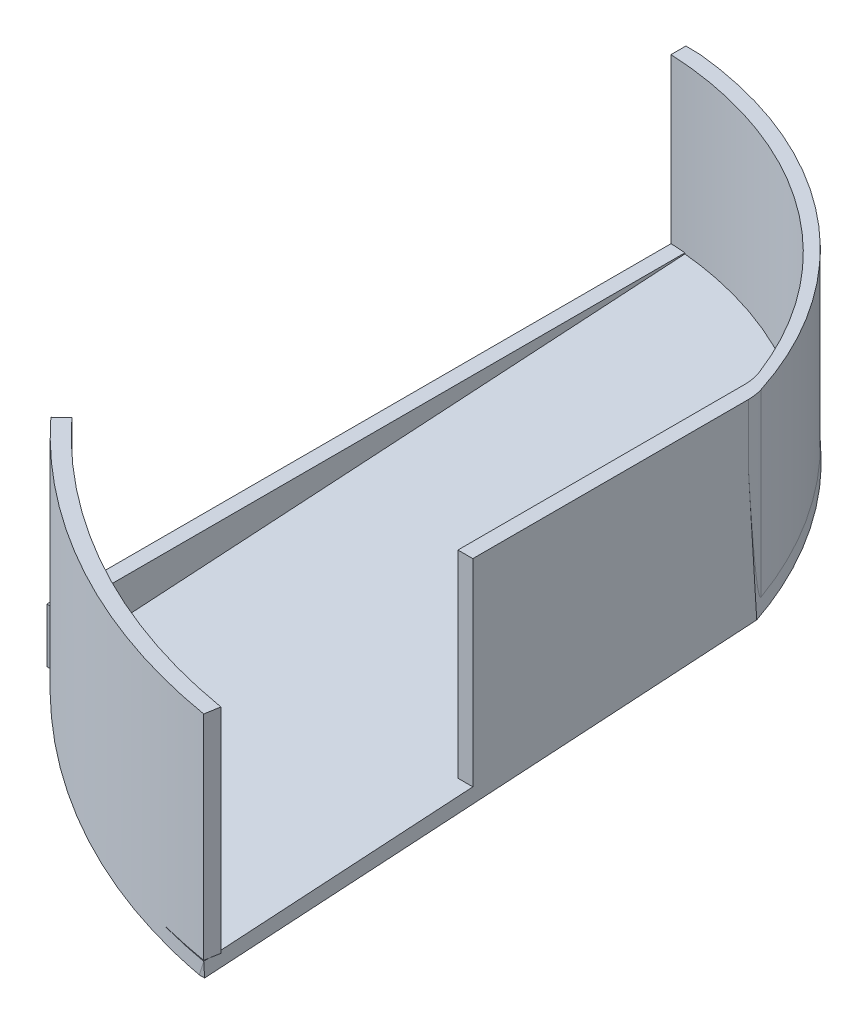
ISO-10303-21;
HEADER;
FILE_DESCRIPTION(('STEP AP214'),'2;1');
FILE_NAME('part.step','',(''),(''),'','','');
FILE_SCHEMA(('AUTOMOTIVE_DESIGN { 1 0 10303 214 1 1 1 1 }'));
ENDSEC;
DATA;
#1=APPLICATION_CONTEXT('core data for automotive mechanical design processes');
#2=APPLICATION_PROTOCOL_DEFINITION('international standard','automotive_design',2000,#1);
#3=PRODUCT_CONTEXT('',#1,'mechanical');
#4=PRODUCT('Part','Part','',(#3));
#5=PRODUCT_RELATED_PRODUCT_CATEGORY('part','',(#4));
#6=PRODUCT_DEFINITION_FORMATION('','',#4);
#7=PRODUCT_DEFINITION_CONTEXT('part definition',#1,'design');
#8=PRODUCT_DEFINITION('design','',#6,#7);
#9=PRODUCT_DEFINITION_SHAPE('','',#8);
#10=(LENGTH_UNIT() NAMED_UNIT(*) SI_UNIT(.MILLI.,.METRE.));
#11=(NAMED_UNIT(*) PLANE_ANGLE_UNIT() SI_UNIT($,.RADIAN.));
#12=(NAMED_UNIT(*) SI_UNIT($,.STERADIAN.) SOLID_ANGLE_UNIT());
#13=UNCERTAINTY_MEASURE_WITH_UNIT(LENGTH_MEASURE(1.E-05),#10,'distance_accuracy_value','');
#14=(GEOMETRIC_REPRESENTATION_CONTEXT(3) GLOBAL_UNCERTAINTY_ASSIGNED_CONTEXT((#13)) GLOBAL_UNIT_ASSIGNED_CONTEXT((#10,
#11,#12)) REPRESENTATION_CONTEXT('',''));
#15=CARTESIAN_POINT('',(0.,0.,0.));
#16=DIRECTION('',(0.,0.,1.));
#17=DIRECTION('',(1.,0.,0.));
#18=AXIS2_PLACEMENT_3D('',#15,#16,#17);
#19=CARTESIAN_POINT('',(3.,0.,0.));
#20=DIRECTION('',(0.,0.998103426506934,0.0615593209442483));
#21=DIRECTION('',(0.,-0.0615593209442483,0.998103426506934));
#22=AXIS2_PLACEMENT_3D('',#19,#20,#21);
#23=PLANE('',#22);
#24=DIRECTION('',(1.,0.,0.));
#25=VECTOR('',#24,1.);
#26=CARTESIAN_POINT('',(3.,0.,0.));
#27=LINE('',#26,#25);
#28=CARTESIAN_POINT('',(3.,0.,0.));
#29=VERTEX_POINT('',#28);
#30=CARTESIAN_POINT('',(4.15307025275991,0.,0.));
#31=VERTEX_POINT('',#30);
#32=EDGE_CURVE('E257',#29,#31,#27,.T.);
#33=ORIENTED_EDGE('',*,*,#32,.T.);
#34=CARTESIAN_POINT('',(-4.59620733064153,-4.63796637234277,75.198524890352));
#35=DIRECTION('',(0.,-0.998103426506934,-0.0615593209442483));
#36=DIRECTION('',(0.,0.0615593209442483,-0.998103426506934));
#37=AXIS2_PLACEMENT_3D('',#34,#35,#36);
#38=ELLIPSE('',#37,75.8496534533457,75.7057990111478);
#39=CARTESIAN_POINT('',(68.,-3.31349227238321,53.7239193032215));
#40=VERTEX_POINT('',#39);
#41=EDGE_CURVE('E230',#31,#40,#38,.T.);
#42=ORIENTED_EDGE('',*,*,#41,.T.);
#43=DIRECTION('',(0.,-0.0615593209442483,0.998103426506934));
#44=VECTOR('',#43,1.);
#45=CARTESIAN_POINT('',(68.,0.,0.));
#46=LINE('',#45,#44);
#47=CARTESIAN_POINT('',(68.,-10.1765886039971,165.));
#48=VERTEX_POINT('',#47);
#49=EDGE_CURVE('E445',#40,#48,#46,.T.);
#50=ORIENTED_EDGE('',*,*,#49,.T.);
#51=DIRECTION('',(-1.,0.,0.));
#52=VECTOR('',#51,1.);
#53=CARTESIAN_POINT('',(3.,-10.1765886039971,165.));
#54=LINE('',#53,#52);
#55=CARTESIAN_POINT('',(66.9381779480019,-10.1765886039971,165.));
#56=VERTEX_POINT('',#55);
#57=EDGE_CURVE('E440',#48,#56,#54,.T.);
#58=ORIENTED_EDGE('',*,*,#57,.T.);
#59=CARTESIAN_POINT('',(87.7574845787787,-2.98775015092859,48.4424392187365));
#60=DIRECTION('',(0.,0.998103426506934,0.0615593209442483));
#61=DIRECTION('',(0.,0.0615593209442483,-0.998103426506934));
#62=AXIS2_PLACEMENT_3D('',#59,#60,#61);
#63=ELLIPSE('',#62,118.627301690277,118.402316294337);
#64=CARTESIAN_POINT('',(0.796643413223996,-7.943746722035,128.797405509834));
#65=VERTEX_POINT('',#64);
#66=EDGE_CURVE('E341',#56,#65,#63,.F.);
#67=ORIENTED_EDGE('',*,*,#66,.T.);
#68=DIRECTION('',(-1.,0.,0.));
#69=VECTOR('',#68,1.);
#70=CARTESIAN_POINT('',(3.,-7.943746722035,128.797405509834));
#71=LINE('',#70,#69);
#72=CARTESIAN_POINT('',(0.,-7.943746722035,128.797405509834));
#73=VERTEX_POINT('',#72);
#74=EDGE_CURVE('E339',#65,#73,#71,.T.);
#75=ORIENTED_EDGE('',*,*,#74,.T.);
#76=DIRECTION('',(0.,0.0615593209442483,-0.998103426506934));
#77=VECTOR('',#76,1.);
#78=CARTESIAN_POINT('',(0.,0.,0.));
#79=LINE('',#78,#77);
#80=CARTESIAN_POINT('',(0.,-0.185028883709039,3.));
#81=VERTEX_POINT('',#80);
#82=EDGE_CURVE('E296',#73,#81,#79,.T.);
#83=ORIENTED_EDGE('',*,*,#82,.T.);
#84=DIRECTION('',(-1.,0.,0.));
#85=VECTOR('',#84,1.);
#86=CARTESIAN_POINT('',(115.,-0.185028883709039,3.));
#87=LINE('',#86,#85);
#88=CARTESIAN_POINT('',(17.5857661755868,-0.185028883709039,3.));
#89=VERTEX_POINT('',#88);
#90=EDGE_CURVE('E552',#89,#81,#87,.T.);
#91=ORIENTED_EDGE('',*,*,#90,.F.);
#92=CARTESIAN_POINT('',(-4.59620733064153,-4.64935662477894,75.3832028531848));
#93=DIRECTION('',(0.,0.998103426506934,0.0615593209442483));
#94=DIRECTION('',(0.,0.0615593209442483,-0.998103426506934));
#95=AXIS2_PLACEMENT_3D('',#92,#93,#94);
#96=ELLIPSE('',#95,75.8496534533457,75.7057990111478);
#97=CARTESIAN_POINT('',(3.,-0.00366751783602553,0.0594639782044853));
#98=VERTEX_POINT('',#97);
#99=EDGE_CURVE('E238',#89,#98,#96,.T.);
#100=ORIENTED_EDGE('',*,*,#99,.T.);
#101=DIRECTION('',(-0.999802868562587,0.00122226495098737,-0.0198174186616625));
#102=VECTOR('',#101,1.);
#103=CARTESIAN_POINT('',(2.99881732795793,-0.00366607201242203,0.0594405360763079));
#104=LINE('',#103,#102);
#105=CARTESIAN_POINT('',(0.,0.,0.));
#106=VERTEX_POINT('',#105);
#107=EDGE_CURVE('E253',#98,#106,#104,.T.);
#108=ORIENTED_EDGE('',*,*,#107,.T.);
#109=DIRECTION('',(-1.,0.,0.));
#110=VECTOR('',#109,1.);
#111=CARTESIAN_POINT('',(3.,0.,0.));
#112=LINE('',#111,#110);
#113=EDGE_CURVE('E309',#29,#106,#112,.T.);
#114=ORIENTED_EDGE('',*,*,#113,.F.);
#115=EDGE_LOOP('',(#33,#42,#50,#58,#67,#75,#83,#91,#100,#108,#114));
#116=FACE_BOUND('',#115,.T.);
#117=ADVANCED_FACE('F41',(#116),#23,.F.);
#118=CARTESIAN_POINT('',(0.,0.,0.));
#119=DIRECTION('',(1.,0.,0.));
#120=DIRECTION('',(0.,0.,-1.));
#121=AXIS2_PLACEMENT_3D('',#118,#119,#120);
#122=PLANE('',#121);
#123=DIRECTION('',(0.,0.0298112208071704,-0.999555546787664));
#124=VECTOR('',#123,1.);
#125=CARTESIAN_POINT('',(0.,0.,-3.20392731393326));
#126=LINE('',#125,#124);
#127=CARTESIAN_POINT('',(0.,-0.095555454534513,0.));
#128=VERTEX_POINT('',#127);
#129=EDGE_CURVE('E548',#81,#128,#126,.T.);
#130=ORIENTED_EDGE('',*,*,#129,.F.);
#131=ORIENTED_EDGE('',*,*,#82,.F.);
#132=DIRECTION('',(0.,1.,0.));
#133=VECTOR('',#132,1.);
#134=CARTESIAN_POINT('',(0.,-30.,128.797405509834));
#135=LINE('',#134,#133);
#136=CARTESIAN_POINT('',(0.,2.99999999999998,128.797405509834));
#137=VERTEX_POINT('',#136);
#138=EDGE_CURVE('E498',#73,#137,#135,.T.);
#139=ORIENTED_EDGE('',*,*,#138,.T.);
#140=DIRECTION('',(0.,0.,1.));
#141=VECTOR('',#140,1.);
#142=CARTESIAN_POINT('',(0.,3.,0.));
#143=LINE('',#142,#141);
#144=CARTESIAN_POINT('',(0.,3.,3.));
#145=VERTEX_POINT('',#144);
#146=EDGE_CURVE('E304',#145,#137,#143,.T.);
#147=ORIENTED_EDGE('',*,*,#146,.F.);
#148=DIRECTION('',(0.,1.,0.));
#149=VECTOR('',#148,1.);
#150=CARTESIAN_POINT('',(0.,-7.,3.));
#151=LINE('',#150,#149);
#152=CARTESIAN_POINT('',(0.,36.,3.00000000000001));
#153=VERTEX_POINT('',#152);
#154=EDGE_CURVE('E352',#145,#153,#151,.T.);
#155=ORIENTED_EDGE('',*,*,#154,.T.);
#156=DIRECTION('',(0.,0.,1.));
#157=VECTOR('',#156,1.);
#158=CARTESIAN_POINT('',(0.,36.,0.));
#159=LINE('',#158,#157);
#160=CARTESIAN_POINT('',(0.,36.,0.));
#161=VERTEX_POINT('',#160);
#162=EDGE_CURVE('E340',#161,#153,#159,.T.);
#163=ORIENTED_EDGE('',*,*,#162,.F.);
#164=DIRECTION('',(0.,1.,0.));
#165=VECTOR('',#164,1.);
#166=CARTESIAN_POINT('',(0.,-7.,0.));
#167=LINE('',#166,#165);
#168=CARTESIAN_POINT('',(0.,3.,0.));
#169=VERTEX_POINT('',#168);
#170=EDGE_CURVE('E328',#169,#161,#167,.T.);
#171=ORIENTED_EDGE('',*,*,#170,.F.);
#172=DIRECTION('',(0.,1.,0.));
#173=VECTOR('',#172,1.);
#174=CARTESIAN_POINT('',(0.,0.,0.));
#175=LINE('',#174,#173);
#176=EDGE_CURVE('E301',#106,#169,#175,.T.);
#177=ORIENTED_EDGE('',*,*,#176,.F.);
#178=EDGE_CURVE('E336',#128,#106,#167,.T.);
#179=ORIENTED_EDGE('',*,*,#178,.F.);
#180=EDGE_LOOP('',(#130,#131,#139,#147,#155,#163,#171,#177,#179));
#181=FACE_BOUND('',#180,.T.);
#182=ADVANCED_FACE('F333',(#181),#122,.F.);
#183=CARTESIAN_POINT('',(3.,-7.18227832447634,165.184677962833));
#184=DIRECTION('',(0.,-0.0615593209442483,0.998103426506934));
#185=DIRECTION('',(0.,-0.998103426506934,-0.0615593209442483));
#186=AXIS2_PLACEMENT_3D('',#183,#184,#185);
#187=PLANE('',#186);
#188=CARTESIAN_POINT('',(87.7574845787787,-1900.00414057506,48.4424392187362));
#189=DIRECTION('',(0.,-0.0615593209442483,0.998103426506934));
#190=DIRECTION('',(0.,0.998103426506934,0.0615593209442483));
#191=AXIS2_PLACEMENT_3D('',#188,#189,#190);
#192=ELLIPSE('',#191,1923.38567869469,118.402316294337);
#193=CARTESIAN_POINT('',(68.0000000000001,-7.18227832447634,165.184677962833));
#194=VERTEX_POINT('',#193);
#195=EDGE_CURVE('E500',#56,#194,#192,.F.);
#196=ORIENTED_EDGE('',*,*,#195,.F.);
#197=ORIENTED_EDGE('',*,*,#57,.F.);
#198=DIRECTION('',(0.,-0.998103426506934,-0.0615593209442483));
#199=VECTOR('',#198,1.);
#200=CARTESIAN_POINT('',(68.,-7.18227832447634,165.184677962833));
#201=LINE('',#200,#199);
#202=EDGE_CURVE('E290',#194,#48,#201,.T.);
#203=ORIENTED_EDGE('',*,*,#202,.F.);
#204=EDGE_LOOP('',(#196,#197,#203));
#205=FACE_BOUND('',#204,.T.);
#206=ADVANCED_FACE('F510',(#205),#187,.T.);
#207=CARTESIAN_POINT('',(3.,3.,0.));
#208=DIRECTION('',(0.,-1.,0.));
#209=DIRECTION('',(0.,0.,-1.));
#210=AXIS2_PLACEMENT_3D('',#207,#208,#209);
#211=PLANE('',#210);
#212=DIRECTION('',(-1.,0.,0.));
#213=VECTOR('',#212,1.);
#214=CARTESIAN_POINT('',(0.796643413223996,2.99999999999998,128.797405509834));
#215=LINE('',#214,#213);
#216=CARTESIAN_POINT('',(0.796643413223996,2.99999999999998,128.797405509834));
#217=VERTEX_POINT('',#216);
#218=EDGE_CURVE('E458',#217,#137,#215,.T.);
#219=ORIENTED_EDGE('',*,*,#218,.F.);
#220=DIRECTION('',(0.734452195591999,0.,-0.678660424947626));
#221=VECTOR('',#220,1.);
#222=CARTESIAN_POINT('',(66.1834256013238,2.99999999999999,68.3776509607101));
#223=LINE('',#222,#221);
#224=CARTESIAN_POINT('',(2.99999999999998,3.00000000000001,126.761424234991));
#225=VERTEX_POINT('',#224);
#226=EDGE_CURVE('E255',#217,#225,#223,.T.);
#227=ORIENTED_EDGE('',*,*,#226,.T.);
#228=DIRECTION('',(0.,0.,1.));
#229=VECTOR('',#228,1.);
#230=CARTESIAN_POINT('',(3.,3.,0.));
#231=LINE('',#230,#229);
#232=CARTESIAN_POINT('',(3.,3.,3.20852248665127));
#233=VERTEX_POINT('',#232);
#234=EDGE_CURVE('E288',#233,#225,#231,.T.);
#235=ORIENTED_EDGE('',*,*,#234,.F.);
#236=CARTESIAN_POINT('',(-3.54035613265457,2.99999999999999,75.6195503174139));
#237=DIRECTION('',(0.,-1.,0.));
#238=DIRECTION('',(0.,0.,-1.));
#239=AXIS2_PLACEMENT_3D('',#236,#237,#238);
#240=CIRCLE('',#239,72.7057990111478);
#241=EDGE_CURVE('E237',#233,#145,#240,.F.);
#242=ORIENTED_EDGE('',*,*,#241,.T.);
#243=ORIENTED_EDGE('',*,*,#146,.T.);
#244=EDGE_LOOP('',(#219,#227,#235,#242,#243));
#245=FACE_BOUND('',#244,.T.);
#246=ADVANCED_FACE('F456',(#245),#211,.F.);
#247=DIRECTION('',(-1.,0.,0.));
#248=VECTOR('',#247,1.);
#249=CARTESIAN_POINT('',(3.,3.,0.));
#250=LINE('',#249,#248);
#251=CARTESIAN_POINT('',(3.,3.,0.));
#252=VERTEX_POINT('',#251);
#253=EDGE_CURVE('E272',#252,#169,#250,.T.);
#254=ORIENTED_EDGE('',*,*,#253,.T.);
#255=DIRECTION('',(0.999803615381979,0.,0.0198174334646132));
#256=VECTOR('',#255,1.);
#257=CARTESIAN_POINT('',(2.99882180799263,3.,0.0594406248765367));
#258=LINE('',#257,#256);
#259=CARTESIAN_POINT('',(3.,3.,0.0594639782044853));
#260=VERTEX_POINT('',#259);
#261=EDGE_CURVE('E260',#169,#260,#258,.T.);
#262=ORIENTED_EDGE('',*,*,#261,.T.);
#263=EDGE_CURVE('E275',#252,#260,#231,.T.);
#264=ORIENTED_EDGE('',*,*,#263,.F.);
#265=EDGE_LOOP('',(#254,#262,#264));
#266=FACE_BOUND('',#265,.T.);
#267=ADVANCED_FACE('F313',(#266),#211,.F.);
#268=CARTESIAN_POINT('',(0.,2.9943102795208,0.184677962832745));
#269=DIRECTION('',(0.,0.998103426506934,0.0615593209442483));
#270=DIRECTION('',(0.,-0.0615593209442483,0.998103426506934));
#271=AXIS2_PLACEMENT_3D('',#268,#269,#270);
#272=PLANE('',#271);
#273=DIRECTION('',(0.,-0.0615593209442483,0.998103426506934));
#274=VECTOR('',#273,1.);
#275=CARTESIAN_POINT('',(65.,2.9943102795208,0.184677962832745));
#276=LINE('',#275,#274);
#277=CARTESIAN_POINT('',(65.,-0.27217050237445,53.1463677771406));
#278=VERTEX_POINT('',#277);
#279=CARTESIAN_POINT('',(65.,-3.83707161600224,110.946550789113));
#280=VERTEX_POINT('',#279);
#281=EDGE_CURVE('E276',#278,#280,#276,.T.);
#282=ORIENTED_EDGE('',*,*,#281,.F.);
#283=CARTESIAN_POINT('',(55.,-0.27217050237445,53.1463677771406));
#284=DIRECTION('',(0.,0.998103426506934,0.0615593209442483));
#285=DIRECTION('',(0.,0.0615593209442483,-0.998103426506934));
#286=AXIS2_PLACEMENT_3D('',#283,#284,#285);
#287=ELLIPSE('',#286,10.01900177319,10.);
#288=CARTESIAN_POINT('',(64.3357164817001,-0.0511283263508837,49.5624596068169));
#289=VERTEX_POINT('',#288);
#290=EDGE_CURVE('E408',#278,#289,#287,.T.);
#291=ORIENTED_EDGE('',*,*,#290,.T.);
#292=CARTESIAN_POINT('',(-3.54035613265457,-1.65823312864653,75.6195503174139));
#293=DIRECTION('',(0.,0.998103426506934,0.0615593209442483));
#294=DIRECTION('',(0.,0.0615593209442483,-0.998103426506934));
#295=AXIS2_PLACEMENT_3D('',#292,#293,#294);
#296=ELLIPSE('',#295,72.8439529213887,72.7057990111478);
#297=CARTESIAN_POINT('',(3.,2.80781075393686,3.20852248665119));
#298=VERTEX_POINT('',#297);
#299=EDGE_CURVE('E268',#298,#289,#296,.F.);
#300=ORIENTED_EDGE('',*,*,#299,.F.);
#301=DIRECTION('',(0.,0.0615593209442483,-0.998103426506934));
#302=VECTOR('',#301,1.);
#303=CARTESIAN_POINT('',(3.,2.9943102795208,0.184677962832745));
#304=LINE('',#303,#302);
#305=CARTESIAN_POINT('',(2.99999999999998,-4.81247440923244,126.761424234991));
#306=VERTEX_POINT('',#305);
#307=EDGE_CURVE('E267',#306,#298,#304,.T.);
#308=ORIENTED_EDGE('',*,*,#307,.F.);
#309=CARTESIAN_POINT('',(87.7574845787787,0.0179503810284094,48.4424392187365));
#310=DIRECTION('',(0.,0.998103426506934,0.0615593209442483));
#311=DIRECTION('',(0.,0.0615593209442483,-0.998103426506934));
#312=AXIS2_PLACEMENT_3D('',#309,#310,#311);
#313=ELLIPSE('',#312,115.62160115832,115.402316294337);
#314=CARTESIAN_POINT('',(68.,-6.99454840864892,162.140884279421));
#315=VERTEX_POINT('',#314);
#316=EDGE_CURVE('E285',#315,#306,#313,.F.);
#317=ORIENTED_EDGE('',*,*,#316,.F.);
#318=DIRECTION('',(0.,-0.0615593209442483,0.998103426506934));
#319=VECTOR('',#318,1.);
#320=CARTESIAN_POINT('',(68.,2.9943102795208,0.184677962832745));
#321=LINE('',#320,#319);
#322=CARTESIAN_POINT('',(68.,-3.83707161600224,110.946550789113));
#323=VERTEX_POINT('',#322);
#324=EDGE_CURVE('E286',#323,#315,#321,.T.);
#325=ORIENTED_EDGE('',*,*,#324,.F.);
#326=DIRECTION('',(1.,0.,0.));
#327=VECTOR('',#326,1.);
#328=CARTESIAN_POINT('',(0.,-3.83707161600224,110.946550789113));
#329=LINE('',#328,#327);
#330=EDGE_CURVE('E225',#280,#323,#329,.T.);
#331=ORIENTED_EDGE('',*,*,#330,.F.);
#332=EDGE_LOOP('',(#282,#291,#300,#308,#317,#325,#331));
#333=FACE_BOUND('',#332,.T.);
#334=ADVANCED_FACE('F431',(#333),#272,.T.);
#335=CARTESIAN_POINT('',(87.7574845787787,0.0179503810284094,48.4424392187365));
#336=DIRECTION('',(0.,0.998103426506934,0.0615593209442483));
#337=DIRECTION('',(0.,0.0615593209442483,-0.998103426506934));
#338=AXIS2_PLACEMENT_3D('',#335,#336,#337);
#339=ELLIPSE('',#338,118.627301690277,118.402316294337);
#340=CARTESIAN_POINT('',(55.0211960997228,-7.00000000000002,162.229274663265));
#341=VERTEX_POINT('',#340);
#342=EDGE_CURVE('E492',#194,#341,#339,.F.);
#343=ORIENTED_EDGE('',*,*,#342,.F.);
#344=CARTESIAN_POINT('',(68.,-7.00000000000002,162.229274663265));
#345=VERTEX_POINT('',#344);
#346=EDGE_CURVE('E265',#345,#194,#321,.T.);
#347=ORIENTED_EDGE('',*,*,#346,.F.);
#348=DIRECTION('',(-1.,0.,0.));
#349=VECTOR('',#348,1.);
#350=CARTESIAN_POINT('',(0.,-7.00000000000002,162.229274663265));
#351=LINE('',#350,#349);
#352=EDGE_CURVE('E224',#345,#341,#351,.T.);
#353=ORIENTED_EDGE('',*,*,#352,.T.);
#354=EDGE_LOOP('',(#343,#347,#353));
#355=FACE_BOUND('',#354,.T.);
#356=ADVANCED_FACE('F494',(#355),#272,.T.);
#357=CARTESIAN_POINT('',(3.,0.,0.));
#358=DIRECTION('',(1.,0.,0.));
#359=DIRECTION('',(0.,0.,-1.));
#360=AXIS2_PLACEMENT_3D('',#357,#358,#359);
#361=PLANE('',#360);
#362=DIRECTION('',(0.,1.,0.));
#363=VECTOR('',#362,1.);
#364=CARTESIAN_POINT('',(2.99999999999998,-7.00000000000001,126.761424234991));
#365=LINE('',#364,#363);
#366=EDGE_CURVE('E368',#306,#225,#365,.T.);
#367=ORIENTED_EDGE('',*,*,#366,.F.);
#368=ORIENTED_EDGE('',*,*,#307,.T.);
#369=DIRECTION('',(0.,1.,0.));
#370=VECTOR('',#369,1.);
#371=CARTESIAN_POINT('',(3.,-7.,3.20852248665127));
#372=LINE('',#371,#370);
#373=EDGE_CURVE('E242',#233,#298,#372,.F.);
#374=ORIENTED_EDGE('',*,*,#373,.F.);
#375=ORIENTED_EDGE('',*,*,#234,.T.);
#376=EDGE_LOOP('',(#367,#368,#374,#375));
#377=FACE_BOUND('',#376,.T.);
#378=ADVANCED_FACE('F453',(#377),#361,.T.);
#379=DIRECTION('',(0.,1.,0.));
#380=VECTOR('',#379,1.);
#381=CARTESIAN_POINT('',(3.,-7.,0.0594639782044845));
#382=LINE('',#381,#380);
#383=CARTESIAN_POINT('',(3.,0.964130199768576,0.0594639782044508));
#384=VERTEX_POINT('',#383);
#385=EDGE_CURVE('E395',#384,#260,#382,.T.);
#386=ORIENTED_EDGE('',*,*,#385,.F.);
#387=DIRECTION('',(0.,-0.998103426506934,-0.0615593209442483));
#388=VECTOR('',#387,1.);
#389=CARTESIAN_POINT('',(3.,2.9943102795208,0.184677962832745));
#390=LINE('',#389,#388);
#391=EDGE_CURVE('E240',#384,#29,#390,.T.);
#392=ORIENTED_EDGE('',*,*,#391,.T.);
#393=DIRECTION('',(0.,1.,0.));
#394=VECTOR('',#393,1.);
#395=CARTESIAN_POINT('',(3.,0.,0.));
#396=LINE('',#395,#394);
#397=EDGE_CURVE('E298',#29,#252,#396,.T.);
#398=ORIENTED_EDGE('',*,*,#397,.T.);
#399=ORIENTED_EDGE('',*,*,#263,.T.);
#400=EDGE_LOOP('',(#386,#392,#398,#399));
#401=FACE_BOUND('',#400,.T.);
#402=ADVANCED_FACE('F446',(#401),#361,.T.);
#403=CARTESIAN_POINT('',(3.,0.,0.));
#404=DIRECTION('',(0.,0.,1.));
#405=DIRECTION('',(1.,0.,0.));
#406=AXIS2_PLACEMENT_3D('',#403,#404,#405);
#407=PLANE('',#406);
#408=ORIENTED_EDGE('',*,*,#176,.T.);
#409=ORIENTED_EDGE('',*,*,#253,.F.);
#410=ORIENTED_EDGE('',*,*,#397,.F.);
#411=ORIENTED_EDGE('',*,*,#113,.T.);
#412=EDGE_LOOP('',(#408,#409,#410,#411));
#413=FACE_BOUND('',#412,.T.);
#414=ADVANCED_FACE('F318',(#413),#407,.F.);
#415=CARTESIAN_POINT('',(68.,2.9943102795208,0.184677962832745));
#416=DIRECTION('',(1.,0.,0.));
#417=DIRECTION('',(0.,0.,-1.));
#418=AXIS2_PLACEMENT_3D('',#415,#416,#417);
#419=PLANE('',#418);
#420=DIRECTION('',(0.,0.998103426506934,0.0615593209442483));
#421=VECTOR('',#420,1.);
#422=CARTESIAN_POINT('',(68.,-115.10107604116,46.8292753574657));
#423=LINE('',#422,#421);
#424=CARTESIAN_POINT('',(68.,24.0086575671295,55.4090482650002));
#425=VERTEX_POINT('',#424);
#426=EDGE_CURVE('E231',#40,#425,#423,.T.);
#427=ORIENTED_EDGE('',*,*,#426,.T.);
#428=DIRECTION('',(0.,1.,0.));
#429=VECTOR('',#428,1.);
#430=CARTESIAN_POINT('',(68.,2.9943102795208,55.4090482650002));
#431=LINE('',#430,#429);
#432=CARTESIAN_POINT('',(68.,36.,55.4090482650002));
#433=VERTEX_POINT('',#432);
#434=EDGE_CURVE('E413',#425,#433,#431,.T.);
#435=ORIENTED_EDGE('',*,*,#434,.T.);
#436=DIRECTION('',(0.,0.,-1.));
#437=VECTOR('',#436,1.);
#438=CARTESIAN_POINT('',(68.,36.,53.9085972660542));
#439=LINE('',#438,#437);
#440=CARTESIAN_POINT('',(68.,36.,110.946550789113));
#441=VERTEX_POINT('',#440);
#442=EDGE_CURVE('E355',#441,#433,#439,.T.);
#443=ORIENTED_EDGE('',*,*,#442,.F.);
#444=DIRECTION('',(0.,1.,0.));
#445=VECTOR('',#444,1.);
#446=CARTESIAN_POINT('',(68.,-7.00000000000001,110.946550789113));
#447=LINE('',#446,#445);
#448=EDGE_CURVE('E388',#323,#441,#447,.T.);
#449=ORIENTED_EDGE('',*,*,#448,.F.);
#450=ORIENTED_EDGE('',*,*,#324,.T.);
#451=DIRECTION('',(0.,1.,0.));
#452=VECTOR('',#451,1.);
#453=CARTESIAN_POINT('',(68.,-7.00000000000002,162.140884279421));
#454=LINE('',#453,#452);
#455=CARTESIAN_POINT('',(68.,-7.00000000000002,162.140884279421));
#456=VERTEX_POINT('',#455);
#457=EDGE_CURVE('E249',#456,#315,#454,.T.);
#458=ORIENTED_EDGE('',*,*,#457,.F.);
#459=DIRECTION('',(0.,0.,1.));
#460=VECTOR('',#459,1.);
#461=CARTESIAN_POINT('',(68.,-7.,0.184677962832744));
#462=LINE('',#461,#460);
#463=EDGE_CURVE('E245',#456,#345,#462,.T.);
#464=ORIENTED_EDGE('',*,*,#463,.T.);
#465=ORIENTED_EDGE('',*,*,#346,.T.);
#466=ORIENTED_EDGE('',*,*,#202,.T.);
#467=ORIENTED_EDGE('',*,*,#49,.F.);
#468=EDGE_LOOP('',(#427,#435,#443,#449,#450,#458,#464,#465,#466,#467));
#469=FACE_BOUND('',#468,.T.);
#470=ADVANCED_FACE('F418',(#469),#419,.T.);
#471=CARTESIAN_POINT('',(3.,2.9943102795208,0.184677962832745));
#472=DIRECTION('',(0.,0.0615593209442483,-0.998103426506934));
#473=DIRECTION('',(0.,0.998103426506934,0.0615593209442483));
#474=AXIS2_PLACEMENT_3D('',#471,#472,#473);
#475=PLANE('',#474);
#476=DIRECTION('',(0.,0.998103426506934,0.0615593209442483));
#477=VECTOR('',#476,1.);
#478=CARTESIAN_POINT('',(4.15307025275991,-111.787583768777,-6.89464394575581));
#479=LINE('',#478,#477);
#480=CARTESIAN_POINT('',(4.15307025275991,2.9943102795208,0.184677962832745));
#481=VERTEX_POINT('',#480);
#482=EDGE_CURVE('E228',#31,#481,#479,.T.);
#483=ORIENTED_EDGE('',*,*,#482,.F.);
#484=ORIENTED_EDGE('',*,*,#32,.F.);
#485=ORIENTED_EDGE('',*,*,#391,.F.);
#486=CARTESIAN_POINT('',(-4.59620733064153,1222.2394905391,75.383202853185));
#487=DIRECTION('',(0.,0.0615593209442483,-0.998103426506934));
#488=DIRECTION('',(0.,0.998103426506934,0.0615593209442483));
#489=AXIS2_PLACEMENT_3D('',#486,#487,#488);
#490=ELLIPSE('',#489,1229.80237354651,75.7057990111478);
#491=EDGE_CURVE('E218',#481,#384,#490,.T.);
#492=ORIENTED_EDGE('',*,*,#491,.F.);
#493=EDGE_LOOP('',(#483,#484,#485,#492));
#494=FACE_BOUND('',#493,.T.);
#495=ADVANCED_FACE('F236',(#494),#475,.T.);
#496=CARTESIAN_POINT('',(-3.54035613265457,36.,75.6195503174139));
#497=DIRECTION('',(0.,-1.,0.));
#498=DIRECTION('',(0.,0.,-1.));
#499=AXIS2_PLACEMENT_3D('',#496,#497,#498);
#500=PLANE('',#499);
#501=ORIENTED_EDGE('',*,*,#442,.T.);
#502=CARTESIAN_POINT('',(58.,36.,55.4090482650002));
#503=DIRECTION('',(0.,-1.,0.));
#504=DIRECTION('',(0.,0.,-1.));
#505=AXIS2_PLACEMENT_3D('',#502,#503,#504);
#506=CIRCLE('',#505,10.);
#507=CARTESIAN_POINT('',(67.5267401466378,36.,52.3691104073393));
#508=VERTEX_POINT('',#507);
#509=EDGE_CURVE('E68',#433,#508,#506,.F.);
#510=ORIENTED_EDGE('',*,*,#509,.T.);
#511=CARTESIAN_POINT('',(-4.59620733064153,36.,75.3832028531848));
#512=DIRECTION('',(0.,1.,0.));
#513=DIRECTION('',(0.,0.,-1.));
#514=AXIS2_PLACEMENT_3D('',#511,#512,#513);
#515=CIRCLE('',#514,75.7057990111478);
#516=CARTESIAN_POINT('',(3.,36.,0.0594639782044897));
#517=VERTEX_POINT('',#516);
#518=EDGE_CURVE('E347',#508,#517,#515,.T.);
#519=ORIENTED_EDGE('',*,*,#518,.T.);
#520=DIRECTION('',(-0.999803615381979,0.,-0.0198174334646132));
#521=VECTOR('',#520,1.);
#522=CARTESIAN_POINT('',(3.,36.,0.0594639782044897));
#523=LINE('',#522,#521);
#524=EDGE_CURVE('E350',#517,#161,#523,.T.);
#525=ORIENTED_EDGE('',*,*,#524,.T.);
#526=ORIENTED_EDGE('',*,*,#162,.T.);
#527=CARTESIAN_POINT('',(-3.54035613265457,36.,75.6195503174139));
#528=DIRECTION('',(0.,-1.,0.));
#529=DIRECTION('',(0.,0.,-1.));
#530=AXIS2_PLACEMENT_3D('',#527,#528,#529);
#531=CIRCLE('',#530,72.7057990111478);
#532=CARTESIAN_POINT('',(64.3357164817001,36.,49.5624596068168));
#533=VERTEX_POINT('',#532);
#534=EDGE_CURVE('E359',#153,#533,#531,.T.);
#535=ORIENTED_EDGE('',*,*,#534,.T.);
#536=CARTESIAN_POINT('',(55.,36.,53.1463677771406));
#537=DIRECTION('',(0.,-1.,0.));
#538=DIRECTION('',(0.,0.,-1.));
#539=AXIS2_PLACEMENT_3D('',#536,#537,#538);
#540=CIRCLE('',#539,10.);
#541=CARTESIAN_POINT('',(65.,36.,53.1463677771406));
#542=VERTEX_POINT('',#541);
#543=EDGE_CURVE('E398',#533,#542,#540,.T.);
#544=ORIENTED_EDGE('',*,*,#543,.T.);
#545=DIRECTION('',(0.,0.,1.));
#546=VECTOR('',#545,1.);
#547=CARTESIAN_POINT('',(65.,36.,110.946550789113));
#548=LINE('',#547,#546);
#549=CARTESIAN_POINT('',(65.,36.,110.946550789113));
#550=VERTEX_POINT('',#549);
#551=EDGE_CURVE('E356',#542,#550,#548,.T.);
#552=ORIENTED_EDGE('',*,*,#551,.T.);
#553=DIRECTION('',(1.,0.,0.));
#554=VECTOR('',#553,1.);
#555=CARTESIAN_POINT('',(65.,36.,110.946550789113));
#556=LINE('',#555,#554);
#557=EDGE_CURVE('E353',#550,#441,#556,.T.);
#558=ORIENTED_EDGE('',*,*,#557,.T.);
#559=EDGE_LOOP('',(#501,#510,#519,#525,#526,#535,#544,#552,#558));
#560=FACE_BOUND('',#559,.T.);
#561=ADVANCED_FACE('F400',(#560),#500,.F.);
#562=CARTESIAN_POINT('',(-3.54035613265457,-7.00000000000001,75.6195503174139));
#563=DIRECTION('',(0.,1.,0.));
#564=DIRECTION('',(0.,0.,1.));
#565=AXIS2_PLACEMENT_3D('',#562,#563,#564);
#566=CYLINDRICAL_SURFACE('',#565,72.7057990111478);
#567=ORIENTED_EDGE('',*,*,#299,.T.);
#568=DIRECTION('',(0.,1.,0.));
#569=VECTOR('',#568,1.);
#570=CARTESIAN_POINT('',(64.3357164817001,-7.,49.5624596068168));
#571=LINE('',#570,#569);
#572=EDGE_CURVE('E282',#289,#533,#571,.T.);
#573=ORIENTED_EDGE('',*,*,#572,.T.);
#574=ORIENTED_EDGE('',*,*,#534,.F.);
#575=ORIENTED_EDGE('',*,*,#154,.F.);
#576=ORIENTED_EDGE('',*,*,#241,.F.);
#577=ORIENTED_EDGE('',*,*,#373,.T.);
#578=EDGE_LOOP('',(#567,#573,#574,#575,#576,#577));
#579=FACE_BOUND('',#578,.T.);
#580=ADVANCED_FACE('F404',(#579),#566,.F.);
#581=CARTESIAN_POINT('',(65.,-7.00000000000001,110.946550789113));
#582=DIRECTION('',(-1.,0.,0.));
#583=DIRECTION('',(0.,0.,1.));
#584=AXIS2_PLACEMENT_3D('',#581,#582,#583);
#585=PLANE('',#584);
#586=ORIENTED_EDGE('',*,*,#551,.F.);
#587=DIRECTION('',(0.,-1.,0.));
#588=VECTOR('',#587,1.);
#589=CARTESIAN_POINT('',(65.,-0.162213874654948,53.1463677771406));
#590=LINE('',#589,#588);
#591=EDGE_CURVE('E410',#542,#278,#590,.T.);
#592=ORIENTED_EDGE('',*,*,#591,.T.);
#593=ORIENTED_EDGE('',*,*,#281,.T.);
#594=DIRECTION('',(0.,1.,0.));
#595=VECTOR('',#594,1.);
#596=CARTESIAN_POINT('',(65.,-7.00000000000001,110.946550789113));
#597=LINE('',#596,#595);
#598=EDGE_CURVE('E386',#280,#550,#597,.T.);
#599=ORIENTED_EDGE('',*,*,#598,.T.);
#600=EDGE_LOOP('',(#586,#592,#593,#599));
#601=FACE_BOUND('',#600,.T.);
#602=ADVANCED_FACE('F430',(#601),#585,.T.);
#603=CARTESIAN_POINT('',(65.,-7.00000000000001,110.946550789113));
#604=DIRECTION('',(0.,0.,1.));
#605=DIRECTION('',(0.,-1.,0.));
#606=AXIS2_PLACEMENT_3D('',#603,#604,#605);
#607=PLANE('',#606);
#608=ORIENTED_EDGE('',*,*,#598,.F.);
#609=ORIENTED_EDGE('',*,*,#330,.T.);
#610=ORIENTED_EDGE('',*,*,#448,.T.);
#611=ORIENTED_EDGE('',*,*,#557,.F.);
#612=EDGE_LOOP('',(#608,#609,#610,#611));
#613=FACE_BOUND('',#612,.T.);
#614=ADVANCED_FACE('F425',(#613),#607,.T.);
#615=CARTESIAN_POINT('',(-4.59620733064153,-7.00000000000001,75.3832028531848));
#616=DIRECTION('',(0.,1.,0.));
#617=DIRECTION('',(0.,0.,1.));
#618=AXIS2_PLACEMENT_3D('',#615,#616,#617);
#619=CYLINDRICAL_SURFACE('',#618,75.7057990111478);
#620=ORIENTED_EDGE('',*,*,#518,.F.);
#621=DIRECTION('',(0.,1.,0.));
#622=VECTOR('',#621,1.);
#623=CARTESIAN_POINT('',(67.5267401466378,-7.00000000000001,52.3691104073393));
#624=LINE('',#623,#622);
#625=CARTESIAN_POINT('',(67.5267401466378,-0.224232147878136,52.3691104073393));
#626=VERTEX_POINT('',#625);
#627=EDGE_CURVE('E54',#508,#626,#624,.F.);
#628=ORIENTED_EDGE('',*,*,#627,.T.);
#629=CARTESIAN_POINT('',(-4.59620733064153,-1.64365609282194,75.3832028531848));
#630=DIRECTION('',(0.,0.998103426506934,0.0615593209442483));
#631=DIRECTION('',(0.,0.0615593209442483,-0.998103426506934));
#632=AXIS2_PLACEMENT_3D('',#629,#630,#631);
#633=ELLIPSE('',#632,75.8496534533457,75.7057990111478);
#634=EDGE_CURVE('E213',#626,#481,#633,.T.);
#635=ORIENTED_EDGE('',*,*,#634,.T.);
#636=ORIENTED_EDGE('',*,*,#491,.T.);
#637=ORIENTED_EDGE('',*,*,#385,.T.);
#638=EDGE_CURVE('E334',#260,#517,#382,.T.);
#639=ORIENTED_EDGE('',*,*,#638,.T.);
#640=EDGE_LOOP('',(#620,#628,#635,#636,#637,#639));
#641=FACE_BOUND('',#640,.T.);
#642=ADVANCED_FACE('F219',(#641),#619,.T.);
#643=CARTESIAN_POINT('',(3.,-7.,0.0594639782044845));
#644=DIRECTION('',(0.0198174334646132,0.,-0.999803615381979));
#645=DIRECTION('',(-0.999803615381979,0.,-0.0198174334646132));
#646=AXIS2_PLACEMENT_3D('',#643,#644,#645);
#647=PLANE('',#646);
#648=ORIENTED_EDGE('',*,*,#261,.F.);
#649=ORIENTED_EDGE('',*,*,#170,.T.);
#650=ORIENTED_EDGE('',*,*,#524,.F.);
#651=ORIENTED_EDGE('',*,*,#638,.F.);
#652=EDGE_LOOP('',(#648,#649,#650,#651));
#653=FACE_BOUND('',#652,.T.);
#654=ADVANCED_FACE('F326',(#653),#647,.T.);
#655=CARTESIAN_POINT('',(87.7574845787787,-7.,48.4424392187365));
#656=DIRECTION('',(0.,1.,0.));
#657=DIRECTION('',(0.,0.,1.));
#658=AXIS2_PLACEMENT_3D('',#655,#656,#657);
#659=CYLINDRICAL_SURFACE('',#658,118.402316294337);
#660=DIRECTION('',(0.,1.,0.));
#661=VECTOR('',#660,1.);
#662=CARTESIAN_POINT('',(68.,-7.00000000000002,165.184677962833));
#663=LINE('',#662,#661);
#664=CARTESIAN_POINT('',(68.,-7.00000000000002,165.184677962833));
#665=VERTEX_POINT('',#664);
#666=CARTESIAN_POINT('',(68.,36.,165.184677962833));
#667=VERTEX_POINT('',#666);
#668=EDGE_CURVE('E381',#665,#667,#663,.T.);
#669=ORIENTED_EDGE('',*,*,#668,.T.);
#670=CARTESIAN_POINT('',(87.7574845787787,36.,48.4424392187365));
#671=DIRECTION('',(0.,1.,0.));
#672=DIRECTION('',(0.,0.,1.));
#673=AXIS2_PLACEMENT_3D('',#670,#671,#672);
#674=CIRCLE('',#673,118.402316294337);
#675=CARTESIAN_POINT('',(0.796643413223996,36.,128.797405509834));
#676=VERTEX_POINT('',#675);
#677=EDGE_CURVE('E361',#676,#667,#674,.T.);
#678=ORIENTED_EDGE('',*,*,#677,.F.);
#679=DIRECTION('',(0.,1.,0.));
#680=VECTOR('',#679,1.);
#681=CARTESIAN_POINT('',(0.796643413223996,-7.00000000000001,128.797405509834));
#682=LINE('',#681,#680);
#683=EDGE_CURVE('E362',#217,#676,#682,.T.);
#684=ORIENTED_EDGE('',*,*,#683,.F.);
#685=DIRECTION('',(0.,1.,0.));
#686=VECTOR('',#685,1.);
#687=CARTESIAN_POINT('',(0.796643413223996,-30.,128.797405509834));
#688=LINE('',#687,#686);
#689=EDGE_CURVE('E463',#65,#217,#688,.T.);
#690=ORIENTED_EDGE('',*,*,#689,.F.);
#691=ORIENTED_EDGE('',*,*,#66,.F.);
#692=ORIENTED_EDGE('',*,*,#195,.T.);
#693=ORIENTED_EDGE('',*,*,#342,.T.);
#694=CARTESIAN_POINT('',(87.7574845787787,-7.,48.4424392187365));
#695=DIRECTION('',(0.,1.,0.));
#696=DIRECTION('',(0.,0.,1.));
#697=AXIS2_PLACEMENT_3D('',#694,#695,#696);
#698=CIRCLE('',#697,118.402316294337);
#699=EDGE_CURVE('E482',#341,#665,#698,.T.);
#700=ORIENTED_EDGE('',*,*,#699,.T.);
#701=EDGE_LOOP('',(#669,#678,#684,#690,#691,#692,#693,#700));
#702=FACE_BOUND('',#701,.T.);
#703=ADVANCED_FACE('F461',(#702),#659,.T.);
#704=CARTESIAN_POINT('',(2.99999999999998,-7.00000000000001,126.761424234991));
#705=DIRECTION('',(-0.678660424947626,0.,-0.734452195591999));
#706=DIRECTION('',(-0.734452195591999,0.,0.678660424947626));
#707=AXIS2_PLACEMENT_3D('',#704,#705,#706);
#708=PLANE('',#707);
#709=ORIENTED_EDGE('',*,*,#226,.F.);
#710=ORIENTED_EDGE('',*,*,#683,.T.);
#711=DIRECTION('',(-0.734452195591999,0.,0.678660424947626));
#712=VECTOR('',#711,1.);
#713=CARTESIAN_POINT('',(2.99999999999998,36.,126.761424234991));
#714=LINE('',#713,#712);
#715=CARTESIAN_POINT('',(2.99999999999998,36.,126.761424234991));
#716=VERTEX_POINT('',#715);
#717=EDGE_CURVE('E478',#716,#676,#714,.T.);
#718=ORIENTED_EDGE('',*,*,#717,.F.);
#719=EDGE_CURVE('E376',#225,#716,#365,.T.);
#720=ORIENTED_EDGE('',*,*,#719,.F.);
#721=EDGE_LOOP('',(#709,#710,#718,#720));
#722=FACE_BOUND('',#721,.T.);
#723=ADVANCED_FACE('F457',(#722),#708,.T.);
#724=CARTESIAN_POINT('',(87.7574845787787,-7.,48.4424392187365));
#725=DIRECTION('',(0.,1.,0.));
#726=DIRECTION('',(0.,0.,1.));
#727=AXIS2_PLACEMENT_3D('',#724,#725,#726);
#728=CYLINDRICAL_SURFACE('',#727,115.402316294337);
#729=CARTESIAN_POINT('',(87.7574845787787,-7.,48.4424392187365));
#730=DIRECTION('',(0.,-1.,0.));
#731=DIRECTION('',(0.,0.,1.));
#732=AXIS2_PLACEMENT_3D('',#729,#730,#731);
#733=CIRCLE('',#732,115.402316294337);
#734=CARTESIAN_POINT('',(68.5006021469123,-7.00000000000002,162.226739915729));
#735=VERTEX_POINT('',#734);
#736=EDGE_CURVE('E378',#735,#456,#733,.T.);
#737=ORIENTED_EDGE('',*,*,#736,.T.);
#738=ORIENTED_EDGE('',*,*,#457,.T.);
#739=ORIENTED_EDGE('',*,*,#316,.T.);
#740=ORIENTED_EDGE('',*,*,#366,.T.);
#741=ORIENTED_EDGE('',*,*,#719,.T.);
#742=CARTESIAN_POINT('',(87.7574845787787,36.,48.4424392187365));
#743=DIRECTION('',(0.,-1.,0.));
#744=DIRECTION('',(0.,0.,1.));
#745=AXIS2_PLACEMENT_3D('',#742,#743,#744);
#746=CIRCLE('',#745,115.402316294337);
#747=CARTESIAN_POINT('',(68.5006021469123,36.,162.226739915729));
#748=VERTEX_POINT('',#747);
#749=EDGE_CURVE('E475',#748,#716,#746,.T.);
#750=ORIENTED_EDGE('',*,*,#749,.F.);
#751=DIRECTION('',(0.,1.,0.));
#752=VECTOR('',#751,1.);
#753=CARTESIAN_POINT('',(68.5006021469123,-7.00000000000002,162.226739915729));
#754=LINE('',#753,#752);
#755=EDGE_CURVE('E385',#735,#748,#754,.T.);
#756=ORIENTED_EDGE('',*,*,#755,.F.);
#757=EDGE_LOOP('',(#737,#738,#739,#740,#741,#750,#756));
#758=FACE_BOUND('',#757,.T.);
#759=ADVANCED_FACE('F490',(#758),#728,.F.);
#760=CARTESIAN_POINT('',(68.,-7.00000000000002,165.184677962833));
#761=DIRECTION('',(0.985979349034742,0.,0.166867382304109));
#762=DIRECTION('',(0.166867382304109,0.,-0.985979349034742));
#763=AXIS2_PLACEMENT_3D('',#760,#761,#762);
#764=PLANE('',#763);
#765=ORIENTED_EDGE('',*,*,#755,.T.);
#766=DIRECTION('',(0.166867382304109,0.,-0.985979349034742));
#767=VECTOR('',#766,1.);
#768=CARTESIAN_POINT('',(68.,36.,165.184677962833));
#769=LINE('',#768,#767);
#770=EDGE_CURVE('E474',#667,#748,#769,.T.);
#771=ORIENTED_EDGE('',*,*,#770,.F.);
#772=ORIENTED_EDGE('',*,*,#668,.F.);
#773=DIRECTION('',(0.166867382304109,0.,-0.985979349034742));
#774=VECTOR('',#773,1.);
#775=CARTESIAN_POINT('',(68.,-7.00000000000002,165.184677962833));
#776=LINE('',#775,#774);
#777=EDGE_CURVE('E484',#665,#735,#776,.T.);
#778=ORIENTED_EDGE('',*,*,#777,.T.);
#779=EDGE_LOOP('',(#765,#771,#772,#778));
#780=FACE_BOUND('',#779,.T.);
#781=ADVANCED_FACE('F588',(#780),#764,.T.);
#782=CARTESIAN_POINT('',(87.7574845787787,-7.,48.4424392187365));
#783=DIRECTION('',(0.,1.,0.));
#784=DIRECTION('',(0.,0.,1.));
#785=AXIS2_PLACEMENT_3D('',#782,#783,#784);
#786=PLANE('',#785);
#787=ORIENTED_EDGE('',*,*,#463,.F.);
#788=ORIENTED_EDGE('',*,*,#736,.F.);
#789=ORIENTED_EDGE('',*,*,#777,.F.);
#790=ORIENTED_EDGE('',*,*,#699,.F.);
#791=ORIENTED_EDGE('',*,*,#352,.F.);
#792=EDGE_LOOP('',(#787,#788,#789,#790,#791));
#793=FACE_BOUND('',#792,.T.);
#794=ADVANCED_FACE('F571',(#793),#786,.F.);
#795=CARTESIAN_POINT('',(87.7574845787787,36.,48.4424392187365));
#796=DIRECTION('',(0.,1.,0.));
#797=DIRECTION('',(0.,0.,1.));
#798=AXIS2_PLACEMENT_3D('',#795,#796,#797);
#799=PLANE('',#798);
#800=ORIENTED_EDGE('',*,*,#677,.T.);
#801=ORIENTED_EDGE('',*,*,#770,.T.);
#802=ORIENTED_EDGE('',*,*,#749,.T.);
#803=ORIENTED_EDGE('',*,*,#717,.T.);
#804=EDGE_LOOP('',(#800,#801,#802,#803));
#805=FACE_BOUND('',#804,.T.);
#806=ADVANCED_FACE('F564',(#805),#799,.T.);
#807=DIRECTION('',(0.999803440749481,-0.000591044473269789,0.0198174300031655));
#808=VECTOR('',#807,1.);
#809=CARTESIAN_POINT('',(3.00407898366326,-0.0973313478833384,0.0595448290697014));
#810=LINE('',#809,#808);
#811=CARTESIAN_POINT('',(3.,-0.097328936548618,0.0594639782044853));
#812=VERTEX_POINT('',#811);
#813=EDGE_CURVE('E558',#128,#812,#810,.T.);
#814=ORIENTED_EDGE('',*,*,#813,.F.);
#815=ORIENTED_EDGE('',*,*,#178,.T.);
#816=ORIENTED_EDGE('',*,*,#107,.F.);
#817=EDGE_CURVE('E349',#812,#98,#382,.T.);
#818=ORIENTED_EDGE('',*,*,#817,.F.);
#819=EDGE_LOOP('',(#814,#815,#816,#818));
#820=FACE_BOUND('',#819,.T.);
#821=ADVANCED_FACE('F563',(#820),#647,.T.);
#822=CARTESIAN_POINT('',(-4.59620733064153,-2.34382000834564,75.3832028531848));
#823=DIRECTION('',(0.,0.999555546787664,0.0298112208071704));
#824=DIRECTION('',(0.,0.0298112208071704,-0.999555546787664));
#825=AXIS2_PLACEMENT_3D('',#822,#823,#824);
#826=ELLIPSE('',#825,75.7394616581824,75.7057990111478);
#827=EDGE_CURVE('E555',#812,#89,#826,.F.);
#828=ORIENTED_EDGE('',*,*,#827,.F.);
#829=ORIENTED_EDGE('',*,*,#817,.T.);
#830=ORIENTED_EDGE('',*,*,#99,.F.);
#831=EDGE_LOOP('',(#828,#829,#830));
#832=FACE_BOUND('',#831,.T.);
#833=ADVANCED_FACE('F557',(#832),#619,.T.);
#834=CARTESIAN_POINT('',(0.796643413223996,-30.,128.797405509834));
#835=DIRECTION('',(0.,0.,-1.));
#836=DIRECTION('',(0.,1.,0.));
#837=AXIS2_PLACEMENT_3D('',#834,#835,#836);
#838=PLANE('',#837);
#839=ORIENTED_EDGE('',*,*,#689,.T.);
#840=ORIENTED_EDGE('',*,*,#218,.T.);
#841=ORIENTED_EDGE('',*,*,#138,.F.);
#842=ORIENTED_EDGE('',*,*,#74,.F.);
#843=EDGE_LOOP('',(#839,#840,#841,#842));
#844=FACE_BOUND('',#843,.T.);
#845=ADVANCED_FACE('F537',(#844),#838,.F.);
#846=CARTESIAN_POINT('',(115.,0.,-3.20392731393326));
#847=DIRECTION('',(0.,0.999555546787664,0.0298112208071704));
#848=DIRECTION('',(0.,-0.0298112208071704,0.999555546787664));
#849=AXIS2_PLACEMENT_3D('',#846,#847,#848);
#850=PLANE('',#849);
#851=ORIENTED_EDGE('',*,*,#813,.T.);
#852=ORIENTED_EDGE('',*,*,#827,.T.);
#853=ORIENTED_EDGE('',*,*,#90,.T.);
#854=ORIENTED_EDGE('',*,*,#129,.T.);
#855=EDGE_LOOP('',(#851,#852,#853,#854));
#856=FACE_BOUND('',#855,.T.);
#857=ADVANCED_FACE('F539',(#856),#850,.F.);
#858=CARTESIAN_POINT('',(-4.59620733064153,-116.425550141119,68.3038809445962));
#859=DIRECTION('',(0.,-0.998103426506934,-0.0615593209442483));
#860=DIRECTION('',(0.,0.0615593209442483,-0.998103426506934));
#861=AXIS2_PLACEMENT_3D('',#858,#859,#860);
#862=ELLIPSE('',#861,75.8496534533457,75.7057990111478);
#863=DIRECTION('',(0.,0.998103426506934,0.0615593209442483));
#864=VECTOR('',#863,1.);
#865=SURFACE_OF_LINEAR_EXTRUSION('',#862,#864);
#866=ORIENTED_EDGE('',*,*,#482,.T.);
#867=ORIENTED_EDGE('',*,*,#634,.F.);
#868=CARTESIAN_POINT('',(67.5267401466378,-0.224232147878146,52.3691104073393));
#869=CARTESIAN_POINT('',(67.5289044647945,-0.224653730066944,52.3758928465726));
#870=CARTESIAN_POINT('',(67.5310665629274,-0.224716203391113,52.3826938318686));
#871=CARTESIAN_POINT('',(67.5353648660708,-0.224136079587736,52.3962643022954));
#872=CARTESIAN_POINT('',(67.537501101101,-0.223494399378689,52.4030338168912));
#873=CARTESIAN_POINT('',(67.5437869121162,-0.220561232552216,52.4230268333724));
#874=CARTESIAN_POINT('',(67.5478764212205,-0.217272618065712,52.4361317884208));
#875=CARTESIAN_POINT('',(67.5557536889061,-0.208454499396035,52.4615495021872));
#876=CARTESIAN_POINT('',(67.5595427802753,-0.202935642311274,52.473865707183));
#877=CARTESIAN_POINT('',(67.5668249461765,-0.190151774652499,52.4976884606287));
#878=CARTESIAN_POINT('',(67.5703169110032,-0.182880576174454,52.5091919487622));
#879=CARTESIAN_POINT('',(67.5801161110909,-0.15970294846705,52.5416665978001));
#880=CARTESIAN_POINT('',(67.5860231052792,-0.142052279274397,52.5614990257483));
#881=CARTESIAN_POINT('',(67.5969838796912,-0.104073286459864,52.5986612190818));
#882=CARTESIAN_POINT('',(67.6020344766128,-0.0837354519237459,52.6159816139595));
#883=CARTESIAN_POINT('',(67.6141765192215,-0.0294979390002947,52.657989071977));
#884=CARTESIAN_POINT('',(67.6208043988164,0.00556060062568455,52.6812946548223));
#885=CARTESIAN_POINT('',(67.6330419850455,0.077731627222706,52.7248337123537));
#886=CARTESIAN_POINT('',(67.6386491350149,0.114848975955993,52.7450594526786));
#887=CARTESIAN_POINT('',(67.6491615374065,0.190500046706951,52.7833906365193));
#888=CARTESIAN_POINT('',(67.654062920675,0.229040221574108,52.8014843001047));
#889=CARTESIAN_POINT('',(67.6633109578683,0.306868463918759,52.8359687909757));
#890=CARTESIAN_POINT('',(67.6676583099117,0.346155517043777,52.8523617563173));
#891=CARTESIAN_POINT('',(67.6781378649635,0.446396405962341,52.8922499947012));
#892=CARTESIAN_POINT('',(67.683984915854,0.507727380294257,52.9148684843787));
#893=CARTESIAN_POINT('',(67.6949678772181,0.631224223755252,52.9579081730724));
#894=CARTESIAN_POINT('',(67.7001035749732,0.693390336548671,52.9783287144229));
#895=CARTESIAN_POINT('',(67.7098404520931,0.818416430889877,53.0175201168649));
#896=CARTESIAN_POINT('',(67.7144405389045,0.881277553894069,53.0362875876375));
#897=CARTESIAN_POINT('',(67.7232077934598,1.00741812139901,53.0724748801675));
#898=CARTESIAN_POINT('',(67.7273749304756,1.0706975952533,53.0898946062476));
#899=CARTESIAN_POINT('',(67.7393588289669,1.26112328749599,53.1405460568042));
#900=CARTESIAN_POINT('',(67.7466493024797,1.38873931363189,53.1721344091498));
#901=CARTESIAN_POINT('',(67.7602380294241,1.64471002103871,53.2321942719372));
#902=CARTESIAN_POINT('',(67.7665365067629,1.77306452882507,53.2606664852902));
#903=CARTESIAN_POINT('',(67.7783743729628,2.03013138173688,53.3152067237819));
#904=CARTESIAN_POINT('',(67.7839147907364,2.15884299496776,53.3412779916735));
#905=CARTESIAN_POINT('',(67.7944016648123,2.41658423992032,53.3915370584362));
#906=CARTESIAN_POINT('',(67.7993484317332,2.54561366896274,53.4157258399394));
#907=CARTESIAN_POINT('',(67.8133967289032,2.9310074822435,53.485638097788));
#908=CARTESIAN_POINT('',(67.82179960299,3.18779931025986,53.5291438303024));
#909=CARTESIAN_POINT('',(67.8372825220349,3.70210720019141,53.6119308069722));
#910=CARTESIAN_POINT('',(67.8443624802887,3.9596233084542,53.6512117741637));
#911=CARTESIAN_POINT('',(67.8575236852445,4.47538177720626,53.7265822222556));
#912=CARTESIAN_POINT('',(67.8636040290761,4.73362458229097,53.7626688044989));
#913=CARTESIAN_POINT('',(67.8749702486626,5.2504741019051,53.8322793438877));
#914=CARTESIAN_POINT('',(67.8802561123321,5.50908082190996,53.8658032620465));
#915=CARTESIAN_POINT('',(67.8951558791599,6.28547754591662,53.9632817309755));
#916=CARTESIAN_POINT('',(67.9038079167276,6.80367707952079,54.0241192935836));
#917=CARTESIAN_POINT('',(67.9192951011855,7.84002397429123,54.1398131820191));
#918=CARTESIAN_POINT('',(67.9261327736329,8.35817039371069,54.1946777586679));
#919=CARTESIAN_POINT('',(67.9384394148309,9.39471402978572,54.2998930515221));
#920=CARTESIAN_POINT('',(67.9439089609259,9.91311104784172,54.3502456659827));
#921=CARTESIAN_POINT('',(67.9537728697708,10.9501799310643,54.4473910733933));
#922=CARTESIAN_POINT('',(67.9581673692313,11.4688517528692,54.4941843184558));
#923=CARTESIAN_POINT('',(67.9659407167774,12.4879251122269,54.5832457412019));
#924=CARTESIAN_POINT('',(67.9693502344966,12.9883175459402,54.6256158458679));
#925=CARTESIAN_POINT('',(67.9754880235303,13.9893502355982,54.7080862416184));
#926=CARTESIAN_POINT('',(67.9782162173989,14.4899905132406,54.7481862742637));
#927=CARTESIAN_POINT('',(67.9830909738605,15.4914674099119,54.8264412307615));
#928=CARTESIAN_POINT('',(67.9852374880241,15.9923040418147,54.8645959924404));
#929=CARTESIAN_POINT('',(67.9890265437599,16.9941276789871,54.9392143902917));
#930=CARTESIAN_POINT('',(67.990669062527,17.4951146900348,54.9756779498766));
#931=CARTESIAN_POINT('',(67.9935117469969,18.4970820139298,55.0471089722153));
#932=CARTESIAN_POINT('',(67.9947120131119,18.998062302441,55.0820767729808));
#933=CARTESIAN_POINT('',(67.9967208831854,20.0000910318862,55.1506901465432));
#934=CARTESIAN_POINT('',(67.9975295050638,20.5011394686526,55.1843357797718));
#935=CARTESIAN_POINT('',(67.9987968337431,21.5032653820668,55.2504424076869));
#936=CARTESIAN_POINT('',(67.9992555748893,22.0043428510344,55.2829035183516));
#937=CARTESIAN_POINT('',(67.9998566535364,23.006489667576,55.3467518366707));
#938=CARTESIAN_POINT('',(67.9999990393065,23.5075590047224,55.3781392074356));
#939=CARTESIAN_POINT('',(68.0000000000003,24.0086575671295,55.4090482650012));
#940=B_SPLINE_CURVE_WITH_KNOTS('',3,(#868,#869,#870,#871,#872,#873,#874,#875,#876,#877,#878,
#879,#880,#881,#882,#883,#884,#885,#886,#887,#888,#889,#890,#891,#892,#893,#894,#895,#896,#897,
#898,#899,#900,#901,#902,#903,#904,#905,#906,#907,#908,#909,#910,#911,#912,#913,#914,#915,#916,
#917,#918,#919,#920,#921,#922,#923,#924,#925,#926,#927,#928,#929,#930,#931,#932,#933,#934,#935,
#936,#937,#938,#939),.UNSPECIFIED.,.F.,.F.,(4,2,2,2,2,2,2,2,2,2,2,2,2,2,2,2,2,2,2,2,2,2,2,2,2,2,
2,2,2,2,2,2,2,2,2,4),(0.,0.0213787474553784,0.0427296894222967,0.0848213015240992,
0.126714299873106,0.168757456964773,0.24988065737411,0.331299086291117,0.458815788090162,
0.586647618932398,0.71515554659897,0.843499909540091,1.04031675410902,1.23719232704898,
1.43446270587299,1.63174707624623,2.02668476143291,2.42153317563114,2.81584023085939,
3.20994006312741,3.9916367641656,4.77338467990368,5.55583485119107,6.33829692379907,
7.90372726329446,9.46696698858427,11.0295459151568,12.5919260297663,14.0985032944895,
15.6052517338321,17.1121255832939,18.6190676063869,20.1256672720315,21.6321979961104,
23.1385808158131,24.6447337774266),.UNSPECIFIED.);
#941=EDGE_CURVE('E11',#626,#425,#940,.T.);
#942=ORIENTED_EDGE('',*,*,#941,.T.);
#943=ORIENTED_EDGE('',*,*,#426,.F.);
#944=ORIENTED_EDGE('',*,*,#41,.F.);
#945=EDGE_LOOP('',(#866,#867,#942,#943,#944));
#946=FACE_BOUND('',#945,.T.);
#947=ADVANCED_FACE('F227',(#946),#865,.F.);
#948=CARTESIAN_POINT('',(55.,-7.00000000000001,53.1463677771406));
#949=DIRECTION('',(0.,1.,0.));
#950=DIRECTION('',(0.,0.,1.));
#951=AXIS2_PLACEMENT_3D('',#948,#949,#950);
#952=CYLINDRICAL_SURFACE('',#951,10.);
#953=ORIENTED_EDGE('',*,*,#290,.F.);
#954=ORIENTED_EDGE('',*,*,#591,.F.);
#955=ORIENTED_EDGE('',*,*,#543,.F.);
#956=ORIENTED_EDGE('',*,*,#572,.F.);
#957=EDGE_LOOP('',(#953,#954,#955,#956));
#958=FACE_BOUND('',#957,.T.);
#959=ADVANCED_FACE('F530',(#958),#952,.F.);
#960=CARTESIAN_POINT('',(58.,-7.00000000000001,55.4090482650002));
#961=DIRECTION('',(0.,1.,0.));
#962=DIRECTION('',(0.,0.,1.));
#963=AXIS2_PLACEMENT_3D('',#960,#961,#962);
#964=CYLINDRICAL_SURFACE('',#963,10.);
#965=ORIENTED_EDGE('',*,*,#941,.F.);
#966=ORIENTED_EDGE('',*,*,#627,.F.);
#967=ORIENTED_EDGE('',*,*,#509,.F.);
#968=ORIENTED_EDGE('',*,*,#434,.F.);
#969=EDGE_LOOP('',(#965,#966,#967,#968));
#970=FACE_BOUND('',#969,.T.);
#971=ADVANCED_FACE('F43',(#970),#964,.T.);
#972=CLOSED_SHELL('',(#117,#182,#206,#246,#267,#334,#356,#378,#402,#414,#470,#495,#561,#580,
#602,#614,#642,#654,#703,#723,#759,#781,#794,#806,#821,#833,#845,#857,#947,#959,#971));
#973=MANIFOLD_SOLID_BREP('B2',#972);
#974=ADVANCED_BREP_SHAPE_REPRESENTATION('',(#18,#973),#14);
#975=SHAPE_DEFINITION_REPRESENTATION(#9,#974);
ENDSEC;
END-ISO-10303-21;
